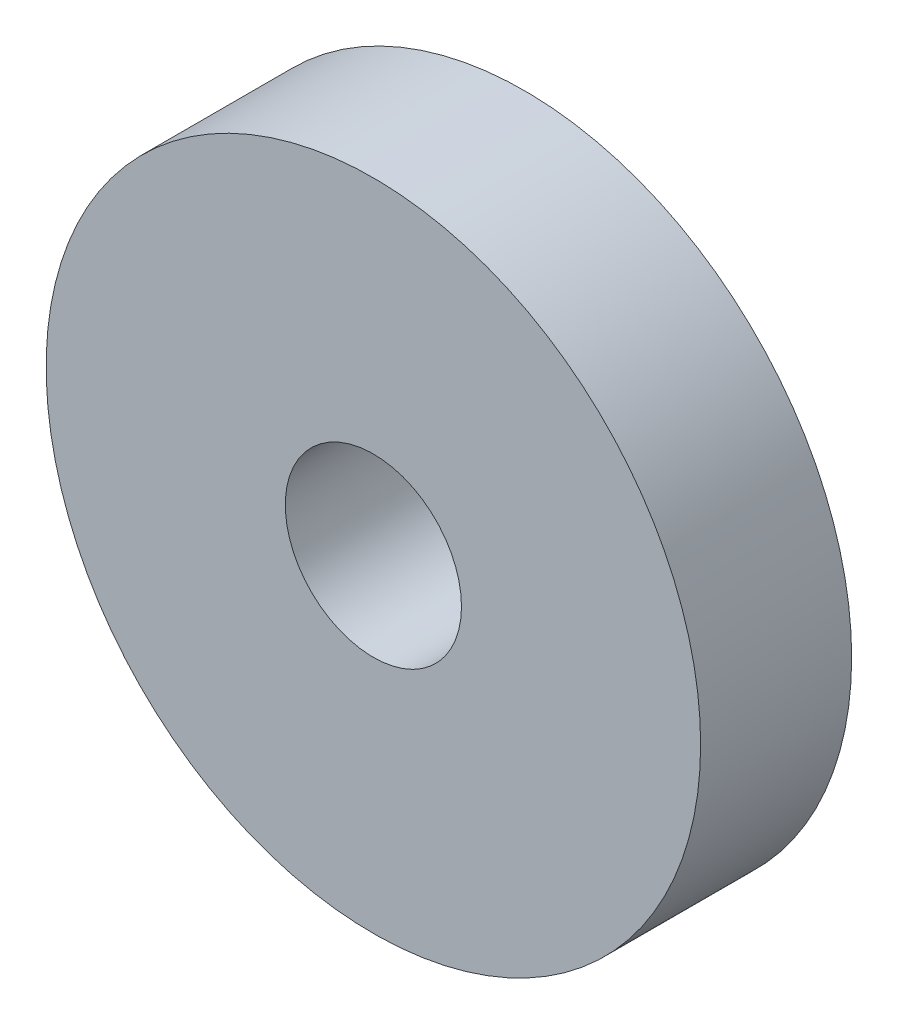
ISO-10303-21;
HEADER;
FILE_DESCRIPTION(('STEP AP214'),'2;1');
FILE_NAME('part.step','',(''),(''),'','','');
FILE_SCHEMA(('AUTOMOTIVE_DESIGN { 1 0 10303 214 1 1 1 1 }'));
ENDSEC;
DATA;
#1=APPLICATION_CONTEXT('core data for automotive mechanical design processes');
#2=APPLICATION_PROTOCOL_DEFINITION('international standard','automotive_design',2000,#1);
#3=PRODUCT_CONTEXT('',#1,'mechanical');
#4=PRODUCT('Part','Part','',(#3));
#5=PRODUCT_RELATED_PRODUCT_CATEGORY('part','',(#4));
#6=PRODUCT_DEFINITION_FORMATION('','',#4);
#7=PRODUCT_DEFINITION_CONTEXT('part definition',#1,'design');
#8=PRODUCT_DEFINITION('design','',#6,#7);
#9=PRODUCT_DEFINITION_SHAPE('','',#8);
#10=(LENGTH_UNIT() NAMED_UNIT(*) SI_UNIT(.MILLI.,.METRE.));
#11=(NAMED_UNIT(*) PLANE_ANGLE_UNIT() SI_UNIT($,.RADIAN.));
#12=(NAMED_UNIT(*) SI_UNIT($,.STERADIAN.) SOLID_ANGLE_UNIT());
#13=UNCERTAINTY_MEASURE_WITH_UNIT(LENGTH_MEASURE(1.E-05),#10,'distance_accuracy_value','');
#14=(GEOMETRIC_REPRESENTATION_CONTEXT(3) GLOBAL_UNCERTAINTY_ASSIGNED_CONTEXT((#13)) GLOBAL_UNIT_ASSIGNED_CONTEXT((#10,
#11,#12)) REPRESENTATION_CONTEXT('',''));
#15=CARTESIAN_POINT('',(0.,0.,0.));
#16=DIRECTION('',(0.,0.,1.));
#17=DIRECTION('',(1.,0.,0.));
#18=AXIS2_PLACEMENT_3D('',#15,#16,#17);
#19=CARTESIAN_POINT('',(-9.5,0.,21.3847763108502));
#20=DIRECTION('',(0.,0.,-1.));
#21=DIRECTION('',(-1.,0.,0.));
#22=AXIS2_PLACEMENT_3D('',#19,#20,#21);
#23=CYLINDRICAL_SURFACE('',#22,6.5);
#24=CARTESIAN_POINT('',(-9.5,0.,0.));
#25=DIRECTION('',(0.,0.,1.));
#26=DIRECTION('',(1.,0.,0.));
#27=AXIS2_PLACEMENT_3D('',#24,#25,#26);
#28=CIRCLE('',#27,6.5);
#29=CARTESIAN_POINT('',(-3.,0.,0.));
#30=VERTEX_POINT('',#29);
#31=EDGE_CURVE('E38',#30,#30,#28,.T.);
#32=ORIENTED_EDGE('',*,*,#31,.T.);
#33=EDGE_LOOP('',(#32));
#34=FACE_BOUND('',#33,.T.);
#35=CARTESIAN_POINT('',(-9.5,0.,2.99999999999999));
#36=DIRECTION('',(0.,0.,1.));
#37=DIRECTION('',(1.,0.,0.));
#38=AXIS2_PLACEMENT_3D('',#35,#36,#37);
#39=CIRCLE('',#38,6.5);
#40=CARTESIAN_POINT('',(-3.,0.,2.99999999999999));
#41=VERTEX_POINT('',#40);
#42=EDGE_CURVE('E10',#41,#41,#39,.T.);
#43=ORIENTED_EDGE('',*,*,#42,.F.);
#44=EDGE_LOOP('',(#43));
#45=FACE_BOUND('',#44,.T.);
#46=ADVANCED_FACE('F31',(#34,#45),#23,.T.);
#47=CARTESIAN_POINT('',(-9.5,0.,0.));
#48=DIRECTION('',(0.,0.,1.));
#49=DIRECTION('',(1.,0.,0.));
#50=AXIS2_PLACEMENT_3D('',#47,#48,#49);
#51=PLANE('',#50);
#52=ORIENTED_EDGE('',*,*,#31,.F.);
#53=EDGE_LOOP('',(#52));
#54=FACE_BOUND('',#53,.T.);
#55=CARTESIAN_POINT('',(-9.5,0.,0.));
#56=DIRECTION('',(0.,0.,1.));
#57=DIRECTION('',(1.,0.,0.));
#58=AXIS2_PLACEMENT_3D('',#55,#56,#57);
#59=CIRCLE('',#58,1.75);
#60=CARTESIAN_POINT('',(-7.75,0.,0.));
#61=VERTEX_POINT('',#60);
#62=EDGE_CURVE('E43',#61,#61,#59,.T.);
#63=ORIENTED_EDGE('',*,*,#62,.T.);
#64=EDGE_LOOP('',(#63));
#65=FACE_BOUND('',#64,.T.);
#66=ADVANCED_FACE('F59',(#54,#65),#51,.F.);
#67=CARTESIAN_POINT('',(-9.5,0.,21.3847763108502));
#68=DIRECTION('',(0.,0.,-1.));
#69=DIRECTION('',(-1.,0.,0.));
#70=AXIS2_PLACEMENT_3D('',#67,#68,#69);
#71=CYLINDRICAL_SURFACE('',#70,1.75);
#72=ORIENTED_EDGE('',*,*,#62,.F.);
#73=EDGE_LOOP('',(#72));
#74=FACE_BOUND('',#73,.T.);
#75=CARTESIAN_POINT('',(-9.5,0.,2.99999999999999));
#76=DIRECTION('',(0.,0.,1.));
#77=DIRECTION('',(1.,0.,0.));
#78=AXIS2_PLACEMENT_3D('',#75,#76,#77);
#79=CIRCLE('',#78,1.75);
#80=CARTESIAN_POINT('',(-7.75,0.,2.99999999999999));
#81=VERTEX_POINT('',#80);
#82=EDGE_CURVE('E34',#81,#81,#79,.T.);
#83=ORIENTED_EDGE('',*,*,#82,.T.);
#84=EDGE_LOOP('',(#83));
#85=FACE_BOUND('',#84,.T.);
#86=ADVANCED_FACE('F51',(#74,#85),#71,.F.);
#87=CARTESIAN_POINT('',(-9.5,0.,2.99999999999999));
#88=DIRECTION('',(0.,0.,1.));
#89=DIRECTION('',(1.,0.,0.));
#90=AXIS2_PLACEMENT_3D('',#87,#88,#89);
#91=PLANE('',#90);
#92=ORIENTED_EDGE('',*,*,#82,.F.);
#93=EDGE_LOOP('',(#92));
#94=FACE_BOUND('',#93,.T.);
#95=ORIENTED_EDGE('',*,*,#42,.T.);
#96=EDGE_LOOP('',(#95));
#97=FACE_BOUND('',#96,.T.);
#98=ADVANCED_FACE('F53',(#94,#97),#91,.T.);
#99=CLOSED_SHELL('',(#46,#66,#86,#98));
#100=MANIFOLD_SOLID_BREP('B2',#99);
#101=ADVANCED_BREP_SHAPE_REPRESENTATION('',(#18,#100),#14);
#102=SHAPE_DEFINITION_REPRESENTATION(#9,#101);
ENDSEC;
END-ISO-10303-21;
